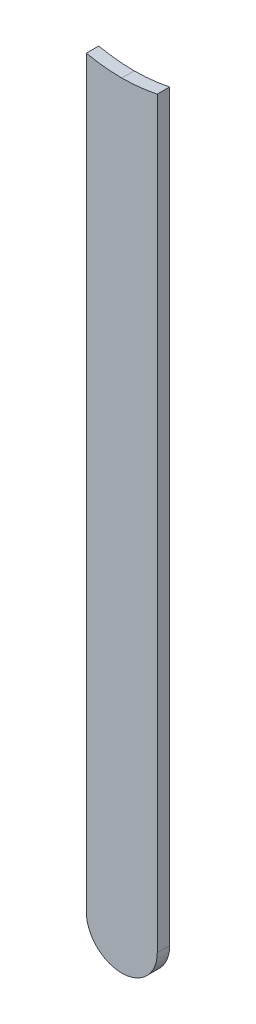
ISO-10303-21;
HEADER;
FILE_DESCRIPTION(('STEP AP214'),'2;1');
FILE_NAME('part.step','',(''),(''),'','','');
FILE_SCHEMA(('AUTOMOTIVE_DESIGN { 1 0 10303 214 1 1 1 1 }'));
ENDSEC;
DATA;
#1=APPLICATION_CONTEXT('core data for automotive mechanical design processes');
#2=APPLICATION_PROTOCOL_DEFINITION('international standard','automotive_design',2000,#1);
#3=PRODUCT_CONTEXT('',#1,'mechanical');
#4=PRODUCT('Part','Part','',(#3));
#5=PRODUCT_RELATED_PRODUCT_CATEGORY('part','',(#4));
#6=PRODUCT_DEFINITION_FORMATION('','',#4);
#7=PRODUCT_DEFINITION_CONTEXT('part definition',#1,'design');
#8=PRODUCT_DEFINITION('design','',#6,#7);
#9=PRODUCT_DEFINITION_SHAPE('','',#8);
#10=(LENGTH_UNIT() NAMED_UNIT(*) SI_UNIT(.MILLI.,.METRE.));
#11=(NAMED_UNIT(*) PLANE_ANGLE_UNIT() SI_UNIT($,.RADIAN.));
#12=(NAMED_UNIT(*) SI_UNIT($,.STERADIAN.) SOLID_ANGLE_UNIT());
#13=UNCERTAINTY_MEASURE_WITH_UNIT(LENGTH_MEASURE(1.E-05),#10,'distance_accuracy_value','');
#14=(GEOMETRIC_REPRESENTATION_CONTEXT(3) GLOBAL_UNCERTAINTY_ASSIGNED_CONTEXT((#13)) GLOBAL_UNIT_ASSIGNED_CONTEXT((#10,
#11,#12)) REPRESENTATION_CONTEXT('',''));
#15=CARTESIAN_POINT('',(0.,0.,0.));
#16=DIRECTION('',(0.,0.,1.));
#17=DIRECTION('',(1.,0.,0.));
#18=AXIS2_PLACEMENT_3D('',#15,#16,#17);
#19=CARTESIAN_POINT('',(107.64,-103.06,1.6));
#20=DIRECTION('',(-1.,0.,0.));
#21=DIRECTION('',(0.,0.,1.));
#22=AXIS2_PLACEMENT_3D('',#19,#20,#21);
#23=PLANE('',#22);
#24=DIRECTION('',(0.,0.,-1.));
#25=VECTOR('',#24,1.);
#26=CARTESIAN_POINT('',(107.64,-100.9643543905,-0.045));
#27=LINE('',#26,#25);
#28=CARTESIAN_POINT('',(107.64,-100.9643543905,1.635));
#29=VERTEX_POINT('',#28);
#30=CARTESIAN_POINT('',(107.64,-100.9643543905,1.6));
#31=VERTEX_POINT('',#30);
#32=EDGE_CURVE('E11',#29,#31,#27,.T.);
#33=ORIENTED_EDGE('',*,*,#32,.F.);
#34=DIRECTION('',(0.,1.,0.));
#35=VECTOR('',#34,1.);
#36=CARTESIAN_POINT('',(107.64,-103.06,1.635));
#37=LINE('',#36,#35);
#38=CARTESIAN_POINT('',(107.64,-103.06,1.635));
#39=VERTEX_POINT('',#38);
#40=EDGE_CURVE('E75',#39,#29,#37,.T.);
#41=ORIENTED_EDGE('',*,*,#40,.F.);
#42=DIRECTION('',(0.,0.,1.));
#43=VECTOR('',#42,1.);
#44=CARTESIAN_POINT('',(107.64,-103.06,1.6));
#45=LINE('',#44,#43);
#46=CARTESIAN_POINT('',(107.64,-103.06,1.6));
#47=VERTEX_POINT('',#46);
#48=EDGE_CURVE('E70',#47,#39,#45,.T.);
#49=ORIENTED_EDGE('',*,*,#48,.F.);
#50=DIRECTION('',(0.,1.,0.));
#51=VECTOR('',#50,1.);
#52=CARTESIAN_POINT('',(107.64,-103.06,1.6));
#53=LINE('',#52,#51);
#54=EDGE_CURVE('E105',#47,#31,#53,.T.);
#55=ORIENTED_EDGE('',*,*,#54,.T.);
#56=EDGE_LOOP('',(#33,#41,#49,#55));
#57=FACE_BOUND('',#56,.T.);
#58=ADVANCED_FACE('F17',(#57),#23,.F.);
#59=CARTESIAN_POINT('',(107.54,-100.5,-0.045));
#60=DIRECTION('',(0.,0.,-1.));
#61=DIRECTION('',(0.,-1.,0.));
#62=AXIS2_PLACEMENT_3D('',#59,#60,#61);
#63=CYLINDRICAL_SURFACE('',#62,0.475);
#64=CARTESIAN_POINT('',(107.54,-100.5,1.6));
#65=DIRECTION('',(0.,0.,-1.));
#66=DIRECTION('',(0.,-1.,0.));
#67=AXIS2_PLACEMENT_3D('',#64,#65,#66);
#68=CIRCLE('',#67,0.475);
#69=CARTESIAN_POINT('',(107.54,-100.975,1.6));
#70=VERTEX_POINT('',#69);
#71=EDGE_CURVE('E141',#31,#70,#68,.T.);
#72=ORIENTED_EDGE('',*,*,#71,.T.);
#73=DIRECTION('',(0.,0.,1.));
#74=VECTOR('',#73,1.);
#75=CARTESIAN_POINT('',(107.54,-100.975,-0.045));
#76=LINE('',#75,#74);
#77=CARTESIAN_POINT('',(107.54,-100.975,1.635));
#78=VERTEX_POINT('',#77);
#79=EDGE_CURVE('E27',#70,#78,#76,.T.);
#80=ORIENTED_EDGE('',*,*,#79,.T.);
#81=CARTESIAN_POINT('',(107.54,-100.5,1.635));
#82=DIRECTION('',(0.,0.,-1.));
#83=DIRECTION('',(0.,-1.,0.));
#84=AXIS2_PLACEMENT_3D('',#81,#82,#83);
#85=CIRCLE('',#84,0.475);
#86=EDGE_CURVE('E20',#29,#78,#85,.T.);
#87=ORIENTED_EDGE('',*,*,#86,.F.);
#88=ORIENTED_EDGE('',*,*,#32,.T.);
#89=EDGE_LOOP('',(#72,#80,#87,#88));
#90=FACE_BOUND('',#89,.T.);
#91=ADVANCED_FACE('F218',(#90),#63,.F.);
#92=CARTESIAN_POINT('',(107.54,-100.5,-0.045));
#93=DIRECTION('',(0.,0.,-1.));
#94=DIRECTION('',(0.,-1.,0.));
#95=AXIS2_PLACEMENT_3D('',#92,#93,#94);
#96=CYLINDRICAL_SURFACE('',#95,0.475);
#97=ORIENTED_EDGE('',*,*,#79,.F.);
#98=CARTESIAN_POINT('',(107.54,-100.5,1.6));
#99=DIRECTION('',(0.,0.,-1.));
#100=DIRECTION('',(0.,-1.,0.));
#101=AXIS2_PLACEMENT_3D('',#98,#99,#100);
#102=CIRCLE('',#101,0.475);
#103=CARTESIAN_POINT('',(107.44,-100.9643543905,1.6));
#104=VERTEX_POINT('',#103);
#105=EDGE_CURVE('E97',#70,#104,#102,.T.);
#106=ORIENTED_EDGE('',*,*,#105,.T.);
#107=DIRECTION('',(0.,0.,-1.));
#108=VECTOR('',#107,1.);
#109=CARTESIAN_POINT('',(107.44,-100.9643543905,-0.045));
#110=LINE('',#109,#108);
#111=CARTESIAN_POINT('',(107.44,-100.9643543905,1.635));
#112=VERTEX_POINT('',#111);
#113=EDGE_CURVE('E123',#112,#104,#110,.T.);
#114=ORIENTED_EDGE('',*,*,#113,.F.);
#115=CARTESIAN_POINT('',(107.54,-100.5,1.635));
#116=DIRECTION('',(0.,0.,-1.));
#117=DIRECTION('',(0.,-1.,0.));
#118=AXIS2_PLACEMENT_3D('',#115,#116,#117);
#119=CIRCLE('',#118,0.475);
#120=EDGE_CURVE('E80',#78,#112,#119,.T.);
#121=ORIENTED_EDGE('',*,*,#120,.F.);
#122=EDGE_LOOP('',(#97,#106,#114,#121));
#123=FACE_BOUND('',#122,.T.);
#124=ADVANCED_FACE('F120',(#123),#96,.F.);
#125=CARTESIAN_POINT('',(107.44,-100.5,1.635));
#126=DIRECTION('',(0.,0.,1.));
#127=DIRECTION('',(1.,0.,0.));
#128=AXIS2_PLACEMENT_3D('',#125,#126,#127);
#129=PLANE('',#128);
#130=ORIENTED_EDGE('',*,*,#120,.T.);
#131=DIRECTION('',(0.,-1.,0.));
#132=VECTOR('',#131,1.);
#133=CARTESIAN_POINT('',(107.44,-100.5,1.635));
#134=LINE('',#133,#132);
#135=CARTESIAN_POINT('',(107.44,-103.06,1.635));
#136=VERTEX_POINT('',#135);
#137=EDGE_CURVE('E86',#112,#136,#134,.T.);
#138=ORIENTED_EDGE('',*,*,#137,.T.);
#139=CARTESIAN_POINT('',(107.54,-103.06,1.635));
#140=DIRECTION('',(0.,0.,1.));
#141=DIRECTION('',(-1.,0.,0.));
#142=AXIS2_PLACEMENT_3D('',#139,#140,#141);
#143=CIRCLE('',#142,0.1);
#144=EDGE_CURVE('E83',#136,#39,#143,.T.);
#145=ORIENTED_EDGE('',*,*,#144,.T.);
#146=ORIENTED_EDGE('',*,*,#40,.T.);
#147=ORIENTED_EDGE('',*,*,#86,.T.);
#148=EDGE_LOOP('',(#130,#138,#145,#146,#147));
#149=FACE_BOUND('',#148,.T.);
#150=ADVANCED_FACE('F84',(#149),#129,.T.);
#151=CARTESIAN_POINT('',(107.54,-103.06,1.6));
#152=DIRECTION('',(0.,0.,-1.));
#153=DIRECTION('',(-1.,0.,0.));
#154=AXIS2_PLACEMENT_3D('',#151,#152,#153);
#155=CYLINDRICAL_SURFACE('',#154,0.1);
#156=CARTESIAN_POINT('',(107.54,-103.06,1.6));
#157=DIRECTION('',(0.,0.,1.));
#158=DIRECTION('',(-1.,0.,0.));
#159=AXIS2_PLACEMENT_3D('',#156,#157,#158);
#160=CIRCLE('',#159,0.1);
#161=CARTESIAN_POINT('',(107.44,-103.06,1.6));
#162=VERTEX_POINT('',#161);
#163=EDGE_CURVE('E94',#162,#47,#160,.T.);
#164=ORIENTED_EDGE('',*,*,#163,.T.);
#165=ORIENTED_EDGE('',*,*,#48,.T.);
#166=ORIENTED_EDGE('',*,*,#144,.F.);
#167=DIRECTION('',(0.,0.,1.));
#168=VECTOR('',#167,1.);
#169=CARTESIAN_POINT('',(107.44,-103.06,1.6));
#170=LINE('',#169,#168);
#171=EDGE_CURVE('E131',#162,#136,#170,.T.);
#172=ORIENTED_EDGE('',*,*,#171,.F.);
#173=EDGE_LOOP('',(#164,#165,#166,#172));
#174=FACE_BOUND('',#173,.T.);
#175=ADVANCED_FACE('F92',(#174),#155,.T.);
#176=CARTESIAN_POINT('',(107.44,-100.5,1.6));
#177=DIRECTION('',(0.,0.,1.));
#178=DIRECTION('',(1.,0.,0.));
#179=AXIS2_PLACEMENT_3D('',#176,#177,#178);
#180=PLANE('',#179);
#181=ORIENTED_EDGE('',*,*,#71,.F.);
#182=ORIENTED_EDGE('',*,*,#54,.F.);
#183=ORIENTED_EDGE('',*,*,#163,.F.);
#184=DIRECTION('',(0.,-1.,0.));
#185=VECTOR('',#184,1.);
#186=CARTESIAN_POINT('',(107.44,-100.5,1.6));
#187=LINE('',#186,#185);
#188=EDGE_CURVE('E128',#104,#162,#187,.T.);
#189=ORIENTED_EDGE('',*,*,#188,.F.);
#190=ORIENTED_EDGE('',*,*,#105,.F.);
#191=EDGE_LOOP('',(#181,#182,#183,#189,#190));
#192=FACE_BOUND('',#191,.T.);
#193=ADVANCED_FACE('F148',(#192),#180,.F.);
#194=CARTESIAN_POINT('',(107.44,-100.5,1.6));
#195=DIRECTION('',(1.,0.,0.));
#196=DIRECTION('',(0.,1.,0.));
#197=AXIS2_PLACEMENT_3D('',#194,#195,#196);
#198=PLANE('',#197);
#199=ORIENTED_EDGE('',*,*,#171,.T.);
#200=ORIENTED_EDGE('',*,*,#137,.F.);
#201=ORIENTED_EDGE('',*,*,#113,.T.);
#202=ORIENTED_EDGE('',*,*,#188,.T.);
#203=EDGE_LOOP('',(#199,#200,#201,#202));
#204=FACE_BOUND('',#203,.T.);
#205=ADVANCED_FACE('F130',(#204),#198,.F.);
#206=CLOSED_SHELL('',(#58,#91,#124,#150,#175,#193,#205));
#207=MANIFOLD_SOLID_BREP('B1',#206);
#208=ADVANCED_BREP_SHAPE_REPRESENTATION('',(#18,#207),#14);
#209=SHAPE_DEFINITION_REPRESENTATION(#9,#208);
ENDSEC;
END-ISO-10303-21;
